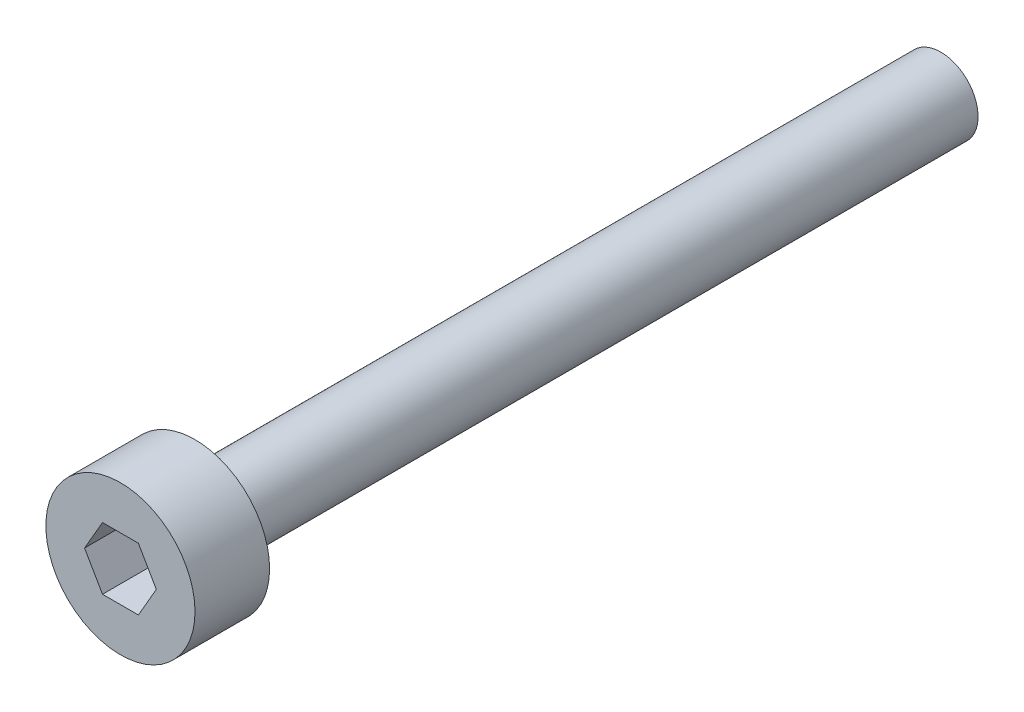
ISO-10303-21;
HEADER;
FILE_DESCRIPTION(('STEP AP214'),'2;1');
FILE_NAME('part.step','',(''),(''),'','','');
FILE_SCHEMA(('AUTOMOTIVE_DESIGN { 1 0 10303 214 1 1 1 1 }'));
ENDSEC;
DATA;
#1=APPLICATION_CONTEXT('core data for automotive mechanical design processes');
#2=APPLICATION_PROTOCOL_DEFINITION('international standard','automotive_design',2000,#1);
#3=PRODUCT_CONTEXT('',#1,'mechanical');
#4=PRODUCT('Part','Part','',(#3));
#5=PRODUCT_RELATED_PRODUCT_CATEGORY('part','',(#4));
#6=PRODUCT_DEFINITION_FORMATION('','',#4);
#7=PRODUCT_DEFINITION_CONTEXT('part definition',#1,'design');
#8=PRODUCT_DEFINITION('design','',#6,#7);
#9=PRODUCT_DEFINITION_SHAPE('','',#8);
#10=(LENGTH_UNIT() NAMED_UNIT(*) SI_UNIT(.MILLI.,.METRE.));
#11=(NAMED_UNIT(*) PLANE_ANGLE_UNIT() SI_UNIT($,.RADIAN.));
#12=(NAMED_UNIT(*) SI_UNIT($,.STERADIAN.) SOLID_ANGLE_UNIT());
#13=UNCERTAINTY_MEASURE_WITH_UNIT(LENGTH_MEASURE(1.E-05),#10,'distance_accuracy_value','');
#14=(GEOMETRIC_REPRESENTATION_CONTEXT(3) GLOBAL_UNCERTAINTY_ASSIGNED_CONTEXT((#13)) GLOBAL_UNIT_ASSIGNED_CONTEXT((#10,
#11,#12)) REPRESENTATION_CONTEXT('',''));
#15=CARTESIAN_POINT('',(0.,0.,0.));
#16=DIRECTION('',(0.,0.,1.));
#17=DIRECTION('',(1.,0.,0.));
#18=AXIS2_PLACEMENT_3D('',#15,#16,#17);
#19=CARTESIAN_POINT('',(0.,0.,3.));
#20=DIRECTION('',(0.,0.,-1.));
#21=DIRECTION('',(-1.,0.,0.));
#22=AXIS2_PLACEMENT_3D('',#19,#20,#21);
#23=CYLINDRICAL_SURFACE('',#22,3.);
#24=CARTESIAN_POINT('',(0.,0.,3.));
#25=DIRECTION('',(0.,0.,1.));
#26=DIRECTION('',(1.,0.,0.));
#27=AXIS2_PLACEMENT_3D('',#24,#25,#26);
#28=CIRCLE('',#27,3.);
#29=CARTESIAN_POINT('',(3.,0.,3.));
#30=VERTEX_POINT('',#29);
#31=EDGE_CURVE('E54',#30,#30,#28,.T.);
#32=ORIENTED_EDGE('',*,*,#31,.F.);
#33=EDGE_LOOP('',(#32));
#34=FACE_BOUND('',#33,.T.);
#35=CARTESIAN_POINT('',(0.,0.,0.));
#36=DIRECTION('',(0.,0.,1.));
#37=DIRECTION('',(1.,0.,0.));
#38=AXIS2_PLACEMENT_3D('',#35,#36,#37);
#39=CIRCLE('',#38,3.);
#40=CARTESIAN_POINT('',(3.,0.,0.));
#41=VERTEX_POINT('',#40);
#42=EDGE_CURVE('E48',#41,#41,#39,.T.);
#43=ORIENTED_EDGE('',*,*,#42,.T.);
#44=EDGE_LOOP('',(#43));
#45=FACE_BOUND('',#44,.T.);
#46=ADVANCED_FACE('F45',(#34,#45),#23,.T.);
#47=CARTESIAN_POINT('',(0.,0.,3.));
#48=DIRECTION('',(0.,0.,1.));
#49=DIRECTION('',(1.,0.,0.));
#50=AXIS2_PLACEMENT_3D('',#47,#48,#49);
#51=PLANE('',#50);
#52=DIRECTION('',(0.5,0.866025403784439,0.));
#53=VECTOR('',#52,1.);
#54=CARTESIAN_POINT('',(0.721687836487033,-1.25,3.));
#55=LINE('',#54,#53);
#56=CARTESIAN_POINT('',(0.721687836487033,-1.25,3.));
#57=VERTEX_POINT('',#56);
#58=CARTESIAN_POINT('',(1.44337567297407,0.,3.));
#59=VERTEX_POINT('',#58);
#60=EDGE_CURVE('E62',#57,#59,#55,.T.);
#61=ORIENTED_EDGE('',*,*,#60,.F.);
#62=DIRECTION('',(1.,0.,0.));
#63=VECTOR('',#62,1.);
#64=CARTESIAN_POINT('',(-0.721687836487031,-1.25,3.));
#65=LINE('',#64,#63);
#66=CARTESIAN_POINT('',(-0.721687836487031,-1.25,3.));
#67=VERTEX_POINT('',#66);
#68=EDGE_CURVE('E156',#67,#57,#65,.T.);
#69=ORIENTED_EDGE('',*,*,#68,.F.);
#70=DIRECTION('',(0.5,-0.866025403784438,0.));
#71=VECTOR('',#70,1.);
#72=CARTESIAN_POINT('',(-1.44337567297406,0.,3.));
#73=LINE('',#72,#71);
#74=CARTESIAN_POINT('',(-1.44337567297406,0.,3.));
#75=VERTEX_POINT('',#74);
#76=EDGE_CURVE('E153',#75,#67,#73,.T.);
#77=ORIENTED_EDGE('',*,*,#76,.F.);
#78=DIRECTION('',(-0.5,-0.866025403784439,0.));
#79=VECTOR('',#78,1.);
#80=CARTESIAN_POINT('',(-0.721687836487032,1.25,3.));
#81=LINE('',#80,#79);
#82=CARTESIAN_POINT('',(-0.721687836487032,1.25,3.));
#83=VERTEX_POINT('',#82);
#84=EDGE_CURVE('E110',#83,#75,#81,.T.);
#85=ORIENTED_EDGE('',*,*,#84,.F.);
#86=DIRECTION('',(-1.,0.,0.));
#87=VECTOR('',#86,1.);
#88=CARTESIAN_POINT('',(0.721687836487032,1.25,3.));
#89=LINE('',#88,#87);
#90=CARTESIAN_POINT('',(0.721687836487032,1.25,3.));
#91=VERTEX_POINT('',#90);
#92=EDGE_CURVE('E147',#91,#83,#89,.T.);
#93=ORIENTED_EDGE('',*,*,#92,.F.);
#94=DIRECTION('',(-0.5,0.866025403784438,0.));
#95=VECTOR('',#94,1.);
#96=CARTESIAN_POINT('',(1.44337567297406,0.,3.));
#97=LINE('',#96,#95);
#98=EDGE_CURVE('E142',#59,#91,#97,.T.);
#99=ORIENTED_EDGE('',*,*,#98,.F.);
#100=EDGE_LOOP('',(#61,#69,#77,#85,#93,#99));
#101=FACE_BOUND('',#100,.T.);
#102=ORIENTED_EDGE('',*,*,#31,.T.);
#103=EDGE_LOOP('',(#102));
#104=FACE_BOUND('',#103,.T.);
#105=ADVANCED_FACE('F182',(#101,#104),#51,.T.);
#106=CARTESIAN_POINT('',(0.,0.,0.));
#107=DIRECTION('',(0.,0.,1.));
#108=DIRECTION('',(1.,0.,0.));
#109=AXIS2_PLACEMENT_3D('',#106,#107,#108);
#110=PLANE('',#109);
#111=CARTESIAN_POINT('',(0.,0.,0.));
#112=DIRECTION('',(0.,0.,-1.));
#113=DIRECTION('',(-1.,0.,0.));
#114=AXIS2_PLACEMENT_3D('',#111,#112,#113);
#115=CIRCLE('',#114,1.5);
#116=CARTESIAN_POINT('',(-1.5,0.,0.));
#117=VERTEX_POINT('',#116);
#118=EDGE_CURVE('E11',#117,#117,#115,.T.);
#119=ORIENTED_EDGE('',*,*,#118,.F.);
#120=EDGE_LOOP('',(#119));
#121=FACE_BOUND('',#120,.T.);
#122=ORIENTED_EDGE('',*,*,#42,.F.);
#123=EDGE_LOOP('',(#122));
#124=FACE_BOUND('',#123,.T.);
#125=ADVANCED_FACE('F179',(#121,#124),#110,.F.);
#126=CARTESIAN_POINT('',(0.721687836487033,-1.25,1.));
#127=DIRECTION('',(0.866025403784439,-0.5,0.));
#128=DIRECTION('',(0.5,0.866025403784439,0.));
#129=AXIS2_PLACEMENT_3D('',#126,#127,#128);
#130=PLANE('',#129);
#131=ORIENTED_EDGE('',*,*,#60,.T.);
#132=DIRECTION('',(0.,0.,1.));
#133=VECTOR('',#132,1.);
#134=CARTESIAN_POINT('',(1.44337567297406,0.,1.));
#135=LINE('',#134,#133);
#136=CARTESIAN_POINT('',(1.44337567297406,0.,1.));
#137=VERTEX_POINT('',#136);
#138=EDGE_CURVE('E92',#137,#59,#135,.T.);
#139=ORIENTED_EDGE('',*,*,#138,.F.);
#140=DIRECTION('',(0.5,0.866025403784439,0.));
#141=VECTOR('',#140,1.);
#142=CARTESIAN_POINT('',(0.721687836487033,-1.25,1.));
#143=LINE('',#142,#141);
#144=CARTESIAN_POINT('',(0.721687836487033,-1.25,1.));
#145=VERTEX_POINT('',#144);
#146=EDGE_CURVE('E159',#145,#137,#143,.T.);
#147=ORIENTED_EDGE('',*,*,#146,.F.);
#148=DIRECTION('',(0.,0.,1.));
#149=VECTOR('',#148,1.);
#150=CARTESIAN_POINT('',(0.721687836487033,-1.25,1.));
#151=LINE('',#150,#149);
#152=EDGE_CURVE('E70',#145,#57,#151,.T.);
#153=ORIENTED_EDGE('',*,*,#152,.T.);
#154=EDGE_LOOP('',(#131,#139,#147,#153));
#155=FACE_BOUND('',#154,.T.);
#156=ADVANCED_FACE('F181',(#155),#130,.F.);
#157=CARTESIAN_POINT('',(-0.721687836487031,-1.25,1.));
#158=DIRECTION('',(0.,-1.,0.));
#159=DIRECTION('',(0.,0.,-1.));
#160=AXIS2_PLACEMENT_3D('',#157,#158,#159);
#161=PLANE('',#160);
#162=ORIENTED_EDGE('',*,*,#68,.T.);
#163=ORIENTED_EDGE('',*,*,#152,.F.);
#164=DIRECTION('',(1.,0.,0.));
#165=VECTOR('',#164,1.);
#166=CARTESIAN_POINT('',(-0.721687836487031,-1.25,1.));
#167=LINE('',#166,#165);
#168=CARTESIAN_POINT('',(-0.721687836487031,-1.25,1.));
#169=VERTEX_POINT('',#168);
#170=EDGE_CURVE('E124',#169,#145,#167,.T.);
#171=ORIENTED_EDGE('',*,*,#170,.F.);
#172=DIRECTION('',(0.,0.,1.));
#173=VECTOR('',#172,1.);
#174=CARTESIAN_POINT('',(-0.721687836487031,-1.25,1.));
#175=LINE('',#174,#173);
#176=EDGE_CURVE('E115',#169,#67,#175,.T.);
#177=ORIENTED_EDGE('',*,*,#176,.T.);
#178=EDGE_LOOP('',(#162,#163,#171,#177));
#179=FACE_BOUND('',#178,.T.);
#180=ADVANCED_FACE('F189',(#179),#161,.F.);
#181=CARTESIAN_POINT('',(-1.44337567297406,0.,1.));
#182=DIRECTION('',(-0.866025403784438,-0.5,0.));
#183=DIRECTION('',(0.5,-0.866025403784438,0.));
#184=AXIS2_PLACEMENT_3D('',#181,#182,#183);
#185=PLANE('',#184);
#186=ORIENTED_EDGE('',*,*,#76,.T.);
#187=ORIENTED_EDGE('',*,*,#176,.F.);
#188=DIRECTION('',(0.5,-0.866025403784438,0.));
#189=VECTOR('',#188,1.);
#190=CARTESIAN_POINT('',(-1.44337567297406,0.,1.));
#191=LINE('',#190,#189);
#192=CARTESIAN_POINT('',(-1.44337567297406,0.,1.));
#193=VERTEX_POINT('',#192);
#194=EDGE_CURVE('E119',#193,#169,#191,.T.);
#195=ORIENTED_EDGE('',*,*,#194,.F.);
#196=DIRECTION('',(0.,0.,1.));
#197=VECTOR('',#196,1.);
#198=CARTESIAN_POINT('',(-1.44337567297406,0.,1.));
#199=LINE('',#198,#197);
#200=EDGE_CURVE('E103',#193,#75,#199,.T.);
#201=ORIENTED_EDGE('',*,*,#200,.T.);
#202=EDGE_LOOP('',(#186,#187,#195,#201));
#203=FACE_BOUND('',#202,.T.);
#204=ADVANCED_FACE('F120',(#203),#185,.F.);
#205=CARTESIAN_POINT('',(-0.721687836487032,1.25,1.));
#206=DIRECTION('',(-0.866025403784439,0.5,0.));
#207=DIRECTION('',(-0.5,-0.866025403784439,0.));
#208=AXIS2_PLACEMENT_3D('',#205,#206,#207);
#209=PLANE('',#208);
#210=ORIENTED_EDGE('',*,*,#84,.T.);
#211=ORIENTED_EDGE('',*,*,#200,.F.);
#212=DIRECTION('',(-0.5,-0.866025403784439,0.));
#213=VECTOR('',#212,1.);
#214=CARTESIAN_POINT('',(-0.721687836487032,1.25,1.));
#215=LINE('',#214,#213);
#216=CARTESIAN_POINT('',(-0.721687836487032,1.25,1.));
#217=VERTEX_POINT('',#216);
#218=EDGE_CURVE('E107',#217,#193,#215,.T.);
#219=ORIENTED_EDGE('',*,*,#218,.F.);
#220=DIRECTION('',(0.,0.,1.));
#221=VECTOR('',#220,1.);
#222=CARTESIAN_POINT('',(-0.721687836487032,1.25,1.));
#223=LINE('',#222,#221);
#224=EDGE_CURVE('E116',#217,#83,#223,.T.);
#225=ORIENTED_EDGE('',*,*,#224,.T.);
#226=EDGE_LOOP('',(#210,#211,#219,#225));
#227=FACE_BOUND('',#226,.T.);
#228=ADVANCED_FACE('F105',(#227),#209,.F.);
#229=CARTESIAN_POINT('',(0.721687836487032,1.25,1.));
#230=DIRECTION('',(0.,1.,0.));
#231=DIRECTION('',(0.,0.,1.));
#232=AXIS2_PLACEMENT_3D('',#229,#230,#231);
#233=PLANE('',#232);
#234=ORIENTED_EDGE('',*,*,#92,.T.);
#235=ORIENTED_EDGE('',*,*,#224,.F.);
#236=DIRECTION('',(-1.,0.,0.));
#237=VECTOR('',#236,1.);
#238=CARTESIAN_POINT('',(0.721687836487032,1.25,1.));
#239=LINE('',#238,#237);
#240=CARTESIAN_POINT('',(0.721687836487032,1.25,1.));
#241=VERTEX_POINT('',#240);
#242=EDGE_CURVE('E130',#241,#217,#239,.T.);
#243=ORIENTED_EDGE('',*,*,#242,.F.);
#244=DIRECTION('',(0.,0.,1.));
#245=VECTOR('',#244,1.);
#246=CARTESIAN_POINT('',(0.721687836487032,1.25,1.));
#247=LINE('',#246,#245);
#248=EDGE_CURVE('E166',#241,#91,#247,.T.);
#249=ORIENTED_EDGE('',*,*,#248,.T.);
#250=EDGE_LOOP('',(#234,#235,#243,#249));
#251=FACE_BOUND('',#250,.T.);
#252=ADVANCED_FACE('F230',(#251),#233,.F.);
#253=CARTESIAN_POINT('',(1.44337567297406,0.,1.));
#254=DIRECTION('',(0.866025403784438,0.5,0.));
#255=DIRECTION('',(-0.5,0.866025403784438,0.));
#256=AXIS2_PLACEMENT_3D('',#253,#254,#255);
#257=PLANE('',#256);
#258=ORIENTED_EDGE('',*,*,#98,.T.);
#259=ORIENTED_EDGE('',*,*,#248,.F.);
#260=DIRECTION('',(-0.5,0.866025403784438,0.));
#261=VECTOR('',#260,1.);
#262=CARTESIAN_POINT('',(1.44337567297406,0.,1.));
#263=LINE('',#262,#261);
#264=EDGE_CURVE('E134',#137,#241,#263,.T.);
#265=ORIENTED_EDGE('',*,*,#264,.F.);
#266=ORIENTED_EDGE('',*,*,#138,.T.);
#267=EDGE_LOOP('',(#258,#259,#265,#266));
#268=FACE_BOUND('',#267,.T.);
#269=ADVANCED_FACE('F238',(#268),#257,.F.);
#270=CARTESIAN_POINT('',(0.,0.,1.));
#271=DIRECTION('',(0.,0.,1.));
#272=DIRECTION('',(1.,0.,0.));
#273=AXIS2_PLACEMENT_3D('',#270,#271,#272);
#274=PLANE('',#273);
#275=ORIENTED_EDGE('',*,*,#146,.T.);
#276=ORIENTED_EDGE('',*,*,#264,.T.);
#277=ORIENTED_EDGE('',*,*,#242,.T.);
#278=ORIENTED_EDGE('',*,*,#218,.T.);
#279=ORIENTED_EDGE('',*,*,#194,.T.);
#280=ORIENTED_EDGE('',*,*,#170,.T.);
#281=EDGE_LOOP('',(#275,#276,#277,#278,#279,#280));
#282=FACE_BOUND('',#281,.T.);
#283=ADVANCED_FACE('F127',(#282),#274,.T.);
#284=CARTESIAN_POINT('',(0.,0.,-30.));
#285=DIRECTION('',(0.,0.,1.));
#286=DIRECTION('',(1.,0.,0.));
#287=AXIS2_PLACEMENT_3D('',#284,#285,#286);
#288=CYLINDRICAL_SURFACE('',#287,1.5);
#289=CARTESIAN_POINT('',(0.,0.,-30.));
#290=DIRECTION('',(0.,0.,-1.));
#291=DIRECTION('',(-1.,0.,0.));
#292=AXIS2_PLACEMENT_3D('',#289,#290,#291);
#293=CIRCLE('',#292,1.5);
#294=CARTESIAN_POINT('',(-1.5,0.,-30.));
#295=VERTEX_POINT('',#294);
#296=EDGE_CURVE('E143',#295,#295,#293,.T.);
#297=ORIENTED_EDGE('',*,*,#296,.F.);
#298=EDGE_LOOP('',(#297));
#299=FACE_BOUND('',#298,.T.);
#300=ORIENTED_EDGE('',*,*,#118,.T.);
#301=EDGE_LOOP('',(#300));
#302=FACE_BOUND('',#301,.T.);
#303=ADVANCED_FACE('F253',(#299,#302),#288,.T.);
#304=CARTESIAN_POINT('',(0.,0.,-30.));
#305=DIRECTION('',(0.,0.,-1.));
#306=DIRECTION('',(-1.,0.,0.));
#307=AXIS2_PLACEMENT_3D('',#304,#305,#306);
#308=PLANE('',#307);
#309=ORIENTED_EDGE('',*,*,#296,.T.);
#310=EDGE_LOOP('',(#309));
#311=FACE_BOUND('',#310,.T.);
#312=ADVANCED_FACE('F264',(#311),#308,.T.);
#313=CLOSED_SHELL('',(#46,#105,#125,#156,#180,#204,#228,#252,#269,#283,#303,#312));
#314=MANIFOLD_SOLID_BREP('B2',#313);
#315=ADVANCED_BREP_SHAPE_REPRESENTATION('',(#18,#314),#14);
#316=SHAPE_DEFINITION_REPRESENTATION(#9,#315);
ENDSEC;
END-ISO-10303-21;
